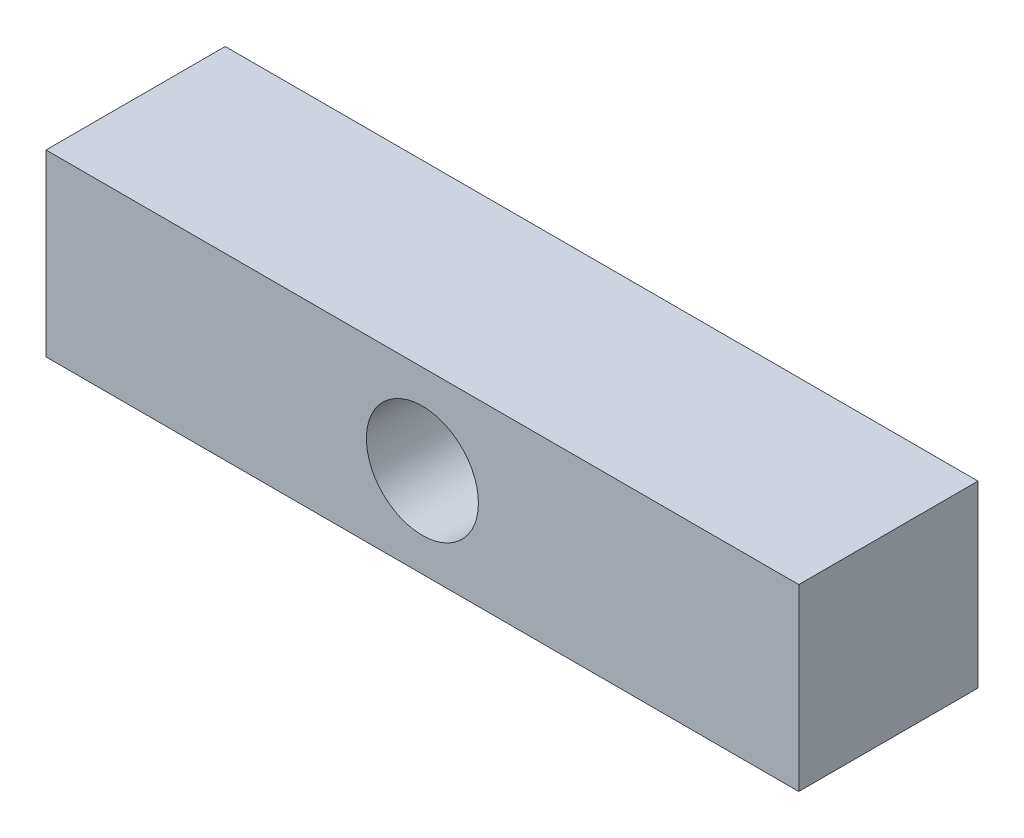
ISO-10303-21;
HEADER;
FILE_DESCRIPTION(('STEP AP214'),'2;1');
FILE_NAME('part.step','',(''),(''),'','','');
FILE_SCHEMA(('AUTOMOTIVE_DESIGN { 1 0 10303 214 1 1 1 1 }'));
ENDSEC;
DATA;
#1=APPLICATION_CONTEXT('core data for automotive mechanical design processes');
#2=APPLICATION_PROTOCOL_DEFINITION('international standard','automotive_design',2000,#1);
#3=PRODUCT_CONTEXT('',#1,'mechanical');
#4=PRODUCT('Part','Part','',(#3));
#5=PRODUCT_RELATED_PRODUCT_CATEGORY('part','',(#4));
#6=PRODUCT_DEFINITION_FORMATION('','',#4);
#7=PRODUCT_DEFINITION_CONTEXT('part definition',#1,'design');
#8=PRODUCT_DEFINITION('design','',#6,#7);
#9=PRODUCT_DEFINITION_SHAPE('','',#8);
#10=(LENGTH_UNIT() NAMED_UNIT(*) SI_UNIT(.MILLI.,.METRE.));
#11=(NAMED_UNIT(*) PLANE_ANGLE_UNIT() SI_UNIT($,.RADIAN.));
#12=(NAMED_UNIT(*) SI_UNIT($,.STERADIAN.) SOLID_ANGLE_UNIT());
#13=UNCERTAINTY_MEASURE_WITH_UNIT(LENGTH_MEASURE(1.E-05),#10,'distance_accuracy_value','');
#14=(GEOMETRIC_REPRESENTATION_CONTEXT(3) GLOBAL_UNCERTAINTY_ASSIGNED_CONTEXT((#13)) GLOBAL_UNIT_ASSIGNED_CONTEXT((#10,
#11,#12)) REPRESENTATION_CONTEXT('',''));
#15=CARTESIAN_POINT('',(0.,0.,0.));
#16=DIRECTION('',(0.,0.,1.));
#17=DIRECTION('',(1.,0.,0.));
#18=AXIS2_PLACEMENT_3D('',#15,#16,#17);
#19=CARTESIAN_POINT('',(53.34,12.7,25.4));
#20=DIRECTION('',(1.,0.,0.));
#21=DIRECTION('',(0.,0.,-1.));
#22=AXIS2_PLACEMENT_3D('',#19,#20,#21);
#23=PLANE('',#22);
#24=DIRECTION('',(0.,-1.,0.));
#25=VECTOR('',#24,1.);
#26=CARTESIAN_POINT('',(53.34,12.7,0.));
#27=LINE('',#26,#25);
#28=CARTESIAN_POINT('',(53.34,12.7,0.));
#29=VERTEX_POINT('',#28);
#30=CARTESIAN_POINT('',(53.34,-12.7,0.));
#31=VERTEX_POINT('',#30);
#32=EDGE_CURVE('E101',#29,#31,#27,.T.);
#33=ORIENTED_EDGE('',*,*,#32,.F.);
#34=DIRECTION('',(0.,0.,-1.));
#35=VECTOR('',#34,1.);
#36=CARTESIAN_POINT('',(53.34,12.7,25.4));
#37=LINE('',#36,#35);
#38=CARTESIAN_POINT('',(53.34,12.7,25.4));
#39=VERTEX_POINT('',#38);
#40=EDGE_CURVE('E11',#39,#29,#37,.T.);
#41=ORIENTED_EDGE('',*,*,#40,.F.);
#42=DIRECTION('',(0.,-1.,0.));
#43=VECTOR('',#42,1.);
#44=CARTESIAN_POINT('',(53.34,12.7,25.4));
#45=LINE('',#44,#43);
#46=CARTESIAN_POINT('',(53.34,-12.7,25.4));
#47=VERTEX_POINT('',#46);
#48=EDGE_CURVE('E95',#39,#47,#45,.T.);
#49=ORIENTED_EDGE('',*,*,#48,.T.);
#50=DIRECTION('',(0.,0.,-1.));
#51=VECTOR('',#50,1.);
#52=CARTESIAN_POINT('',(53.34,-12.7,25.4));
#53=LINE('',#52,#51);
#54=EDGE_CURVE('E38',#47,#31,#53,.T.);
#55=ORIENTED_EDGE('',*,*,#54,.T.);
#56=EDGE_LOOP('',(#33,#41,#49,#55));
#57=FACE_BOUND('',#56,.T.);
#58=ADVANCED_FACE('F35',(#57),#23,.T.);
#59=CARTESIAN_POINT('',(53.34,12.7,25.4));
#60=DIRECTION('',(0.,-1.,0.));
#61=DIRECTION('',(0.,0.,-1.));
#62=AXIS2_PLACEMENT_3D('',#59,#60,#61);
#63=PLANE('',#62);
#64=DIRECTION('',(-1.,0.,0.));
#65=VECTOR('',#64,1.);
#66=CARTESIAN_POINT('',(53.34,12.7,0.));
#67=LINE('',#66,#65);
#68=CARTESIAN_POINT('',(-53.34,12.7,0.));
#69=VERTEX_POINT('',#68);
#70=EDGE_CURVE('E68',#29,#69,#67,.T.);
#71=ORIENTED_EDGE('',*,*,#70,.T.);
#72=DIRECTION('',(0.,0.,-1.));
#73=VECTOR('',#72,1.);
#74=CARTESIAN_POINT('',(-53.34,12.7,25.4));
#75=LINE('',#74,#73);
#76=CARTESIAN_POINT('',(-53.34,12.7,25.4));
#77=VERTEX_POINT('',#76);
#78=EDGE_CURVE('E44',#77,#69,#75,.T.);
#79=ORIENTED_EDGE('',*,*,#78,.F.);
#80=DIRECTION('',(-1.,0.,0.));
#81=VECTOR('',#80,1.);
#82=CARTESIAN_POINT('',(53.34,12.7,25.4));
#83=LINE('',#82,#81);
#84=EDGE_CURVE('E85',#39,#77,#83,.T.);
#85=ORIENTED_EDGE('',*,*,#84,.F.);
#86=ORIENTED_EDGE('',*,*,#40,.T.);
#87=EDGE_LOOP('',(#71,#79,#85,#86));
#88=FACE_BOUND('',#87,.T.);
#89=ADVANCED_FACE('F112',(#88),#63,.F.);
#90=CARTESIAN_POINT('',(-53.34,12.7,25.4));
#91=DIRECTION('',(1.,0.,0.));
#92=DIRECTION('',(0.,0.,-1.));
#93=AXIS2_PLACEMENT_3D('',#90,#91,#92);
#94=PLANE('',#93);
#95=DIRECTION('',(0.,-1.,0.));
#96=VECTOR('',#95,1.);
#97=CARTESIAN_POINT('',(-53.34,12.7,0.));
#98=LINE('',#97,#96);
#99=CARTESIAN_POINT('',(-53.34,-12.7,0.));
#100=VERTEX_POINT('',#99);
#101=EDGE_CURVE('E92',#69,#100,#98,.T.);
#102=ORIENTED_EDGE('',*,*,#101,.T.);
#103=DIRECTION('',(0.,0.,-1.));
#104=VECTOR('',#103,1.);
#105=CARTESIAN_POINT('',(-53.34,-12.7,25.4));
#106=LINE('',#105,#104);
#107=CARTESIAN_POINT('',(-53.34,-12.7,25.4));
#108=VERTEX_POINT('',#107);
#109=EDGE_CURVE('E89',#108,#100,#106,.T.);
#110=ORIENTED_EDGE('',*,*,#109,.F.);
#111=DIRECTION('',(0.,-1.,0.));
#112=VECTOR('',#111,1.);
#113=CARTESIAN_POINT('',(-53.34,12.7,25.4));
#114=LINE('',#113,#112);
#115=EDGE_CURVE('E80',#77,#108,#114,.T.);
#116=ORIENTED_EDGE('',*,*,#115,.F.);
#117=ORIENTED_EDGE('',*,*,#78,.T.);
#118=EDGE_LOOP('',(#102,#110,#116,#117));
#119=FACE_BOUND('',#118,.T.);
#120=ADVANCED_FACE('F90',(#119),#94,.F.);
#121=CARTESIAN_POINT('',(53.34,-12.7,25.4));
#122=DIRECTION('',(0.,-1.,0.));
#123=DIRECTION('',(0.,0.,-1.));
#124=AXIS2_PLACEMENT_3D('',#121,#122,#123);
#125=PLANE('',#124);
#126=DIRECTION('',(-1.,0.,0.));
#127=VECTOR('',#126,1.);
#128=CARTESIAN_POINT('',(53.34,-12.7,0.));
#129=LINE('',#128,#127);
#130=EDGE_CURVE('E104',#31,#100,#129,.T.);
#131=ORIENTED_EDGE('',*,*,#130,.F.);
#132=ORIENTED_EDGE('',*,*,#54,.F.);
#133=DIRECTION('',(-1.,0.,0.));
#134=VECTOR('',#133,1.);
#135=CARTESIAN_POINT('',(53.34,-12.7,25.4));
#136=LINE('',#135,#134);
#137=EDGE_CURVE('E84',#47,#108,#136,.T.);
#138=ORIENTED_EDGE('',*,*,#137,.T.);
#139=ORIENTED_EDGE('',*,*,#109,.T.);
#140=EDGE_LOOP('',(#131,#132,#138,#139));
#141=FACE_BOUND('',#140,.T.);
#142=ADVANCED_FACE('F94',(#141),#125,.T.);
#143=CARTESIAN_POINT('',(0.,0.,25.4));
#144=DIRECTION('',(0.,0.,-1.));
#145=DIRECTION('',(-1.,0.,0.));
#146=AXIS2_PLACEMENT_3D('',#143,#144,#145);
#147=PLANE('',#146);
#148=CARTESIAN_POINT('',(0.,0.,25.4));
#149=DIRECTION('',(0.,0.,1.));
#150=DIRECTION('',(1.,0.,0.));
#151=AXIS2_PLACEMENT_3D('',#148,#149,#150);
#152=CIRCLE('',#151,7.9375);
#153=CARTESIAN_POINT('',(7.9375,0.,25.4));
#154=VERTEX_POINT('',#153);
#155=EDGE_CURVE('E168',#154,#154,#152,.T.);
#156=ORIENTED_EDGE('',*,*,#155,.F.);
#157=EDGE_LOOP('',(#156));
#158=FACE_BOUND('',#157,.T.);
#159=ORIENTED_EDGE('',*,*,#48,.F.);
#160=ORIENTED_EDGE('',*,*,#84,.T.);
#161=ORIENTED_EDGE('',*,*,#115,.T.);
#162=ORIENTED_EDGE('',*,*,#137,.F.);
#163=EDGE_LOOP('',(#159,#160,#161,#162));
#164=FACE_BOUND('',#163,.T.);
#165=ADVANCED_FACE('F83',(#158,#164),#147,.F.);
#166=CARTESIAN_POINT('',(0.,0.,0.));
#167=DIRECTION('',(0.,0.,-1.));
#168=DIRECTION('',(-1.,0.,0.));
#169=AXIS2_PLACEMENT_3D('',#166,#167,#168);
#170=PLANE('',#169);
#171=CARTESIAN_POINT('',(0.,0.,0.));
#172=DIRECTION('',(0.,0.,-1.));
#173=DIRECTION('',(-1.,0.,0.));
#174=AXIS2_PLACEMENT_3D('',#171,#172,#173);
#175=CIRCLE('',#174,4.01319999999999);
#176=CARTESIAN_POINT('',(-4.01319999999999,0.,0.));
#177=VERTEX_POINT('',#176);
#178=EDGE_CURVE('E175',#177,#177,#175,.T.);
#179=ORIENTED_EDGE('',*,*,#178,.F.);
#180=EDGE_LOOP('',(#179));
#181=FACE_BOUND('',#180,.T.);
#182=CARTESIAN_POINT('',(-38.1,0.,0.));
#183=DIRECTION('',(0.,0.,1.));
#184=DIRECTION('',(1.,0.,0.));
#185=AXIS2_PLACEMENT_3D('',#182,#183,#184);
#186=CIRCLE('',#185,8.1915);
#187=CARTESIAN_POINT('',(-46.2915,0.,0.));
#188=VERTEX_POINT('',#187);
#189=EDGE_CURVE('E181',#188,#188,#186,.T.);
#190=ORIENTED_EDGE('',*,*,#189,.T.);
#191=EDGE_LOOP('',(#190));
#192=FACE_BOUND('',#191,.T.);
#193=CARTESIAN_POINT('',(38.1,0.,0.));
#194=DIRECTION('',(0.,0.,1.));
#195=DIRECTION('',(1.,0.,0.));
#196=AXIS2_PLACEMENT_3D('',#193,#194,#195);
#197=CIRCLE('',#196,8.1915);
#198=CARTESIAN_POINT('',(29.9085,0.,0.));
#199=VERTEX_POINT('',#198);
#200=EDGE_CURVE('E184',#199,#199,#197,.T.);
#201=ORIENTED_EDGE('',*,*,#200,.T.);
#202=EDGE_LOOP('',(#201));
#203=FACE_BOUND('',#202,.T.);
#204=ORIENTED_EDGE('',*,*,#32,.T.);
#205=ORIENTED_EDGE('',*,*,#130,.T.);
#206=ORIENTED_EDGE('',*,*,#101,.F.);
#207=ORIENTED_EDGE('',*,*,#70,.F.);
#208=EDGE_LOOP('',(#204,#205,#206,#207));
#209=FACE_BOUND('',#208,.T.);
#210=ADVANCED_FACE('F110',(#181,#192,#203,#209),#170,.T.);
#211=CARTESIAN_POINT('',(38.1,0.,19.05));
#212=DIRECTION('',(0.,0.,-1.));
#213=DIRECTION('',(-1.,0.,0.));
#214=AXIS2_PLACEMENT_3D('',#211,#212,#213);
#215=CYLINDRICAL_SURFACE('',#214,8.1915);
#216=CARTESIAN_POINT('',(38.1,0.,19.05));
#217=DIRECTION('',(0.,0.,1.));
#218=DIRECTION('',(1.,0.,0.));
#219=AXIS2_PLACEMENT_3D('',#216,#217,#218);
#220=CIRCLE('',#219,8.1915);
#221=CARTESIAN_POINT('',(29.9085,0.,19.05));
#222=VERTEX_POINT('',#221);
#223=EDGE_CURVE('E178',#222,#222,#220,.T.);
#224=CARTESIAN_POINT('',(29.9085,0.,19.05));
#225=CARTESIAN_POINT('',(29.9085,0.,18.8515625));
#226=CARTESIAN_POINT('',(29.9085,0.,18.653125));
#227=CARTESIAN_POINT('',(29.9085,0.,18.25625));
#228=CARTESIAN_POINT('',(29.9085,0.,18.0578125));
#229=CARTESIAN_POINT('',(29.9085,0.,17.6609375));
#230=CARTESIAN_POINT('',(29.9085,0.,17.4625));
#231=CARTESIAN_POINT('',(29.9085,0.,17.065625));
#232=CARTESIAN_POINT('',(29.9085,0.,16.8671875));
#233=CARTESIAN_POINT('',(29.9085,0.,16.4703125));
#234=CARTESIAN_POINT('',(29.9085,0.,16.271875));
#235=CARTESIAN_POINT('',(29.9085,0.,15.875));
#236=CARTESIAN_POINT('',(29.9085,0.,15.6765625));
#237=CARTESIAN_POINT('',(29.9085,0.,15.2796875));
#238=CARTESIAN_POINT('',(29.9085,0.,15.08125));
#239=CARTESIAN_POINT('',(29.9085,0.,14.684375));
#240=CARTESIAN_POINT('',(29.9085,0.,14.4859375));
#241=CARTESIAN_POINT('',(29.9085,0.,14.0890625));
#242=CARTESIAN_POINT('',(29.9085,0.,13.890625));
#243=CARTESIAN_POINT('',(29.9085,0.,13.49375));
#244=CARTESIAN_POINT('',(29.9085,0.,13.2953125));
#245=CARTESIAN_POINT('',(29.9085,0.,12.8984375));
#246=CARTESIAN_POINT('',(29.9085,0.,12.7));
#247=CARTESIAN_POINT('',(29.9085,0.,12.303125));
#248=CARTESIAN_POINT('',(29.9085,0.,12.1046875));
#249=CARTESIAN_POINT('',(29.9085,0.,11.7078125));
#250=CARTESIAN_POINT('',(29.9085,0.,11.509375));
#251=CARTESIAN_POINT('',(29.9085,0.,11.1125));
#252=CARTESIAN_POINT('',(29.9085,0.,10.9140625));
#253=CARTESIAN_POINT('',(29.9085,0.,10.5171875));
#254=CARTESIAN_POINT('',(29.9085,0.,10.31875));
#255=CARTESIAN_POINT('',(29.9085,0.,9.921875));
#256=CARTESIAN_POINT('',(29.9085,0.,9.7234375));
#257=CARTESIAN_POINT('',(29.9085,0.,9.3265625));
#258=CARTESIAN_POINT('',(29.9085,0.,9.128125));
#259=CARTESIAN_POINT('',(29.9085,0.,8.73125));
#260=CARTESIAN_POINT('',(29.9085,0.,8.5328125));
#261=CARTESIAN_POINT('',(29.9085,0.,8.1359375));
#262=CARTESIAN_POINT('',(29.9085,0.,7.9375));
#263=CARTESIAN_POINT('',(29.9085,0.,7.540625));
#264=CARTESIAN_POINT('',(29.9085,0.,7.3421875));
#265=CARTESIAN_POINT('',(29.9085,0.,6.9453125));
#266=CARTESIAN_POINT('',(29.9085,0.,6.746875));
#267=CARTESIAN_POINT('',(29.9085,0.,6.35));
#268=CARTESIAN_POINT('',(29.9085,0.,6.1515625));
#269=CARTESIAN_POINT('',(29.9085,0.,5.7546875));
#270=CARTESIAN_POINT('',(29.9085,0.,5.55625));
#271=CARTESIAN_POINT('',(29.9085,0.,5.159375));
#272=CARTESIAN_POINT('',(29.9085,0.,4.9609375));
#273=CARTESIAN_POINT('',(29.9085,0.,4.5640625));
#274=CARTESIAN_POINT('',(29.9085,0.,4.365625));
#275=CARTESIAN_POINT('',(29.9085,0.,3.96875));
#276=CARTESIAN_POINT('',(29.9085,0.,3.7703125));
#277=CARTESIAN_POINT('',(29.9085,0.,3.3734375));
#278=CARTESIAN_POINT('',(29.9085,0.,3.175));
#279=CARTESIAN_POINT('',(29.9085,0.,2.778125));
#280=CARTESIAN_POINT('',(29.9085,0.,2.5796875));
#281=CARTESIAN_POINT('',(29.9085,0.,2.1828125));
#282=CARTESIAN_POINT('',(29.9085,0.,1.984375));
#283=CARTESIAN_POINT('',(29.9085,0.,1.5875));
#284=CARTESIAN_POINT('',(29.9085,0.,1.3890625));
#285=CARTESIAN_POINT('',(29.9085,0.,0.992187500000001));
#286=CARTESIAN_POINT('',(29.9085,0.,0.793750000000001));
#287=CARTESIAN_POINT('',(29.9085,0.,0.396875));
#288=CARTESIAN_POINT('',(29.9085,0.,0.1984375));
#289=CARTESIAN_POINT('',(29.9085,0.,0.));
#290=B_SPLINE_CURVE_WITH_KNOTS('',3,(#224,#225,#226,#227,#228,#229,#230,#231,#232,#233,#234,
#235,#236,#237,#238,#239,#240,#241,#242,#243,#244,#245,#246,#247,#248,#249,#250,#251,#252,#253,
#254,#255,#256,#257,#258,#259,#260,#261,#262,#263,#264,#265,#266,#267,#268,#269,#270,#271,#272,
#273,#274,#275,#276,#277,#278,#279,#280,#281,#282,#283,#284,#285,#286,#287,#288,#289),
.UNSPECIFIED.,.F.,.F.,(4,2,2,2,2,2,2,2,2,2,2,2,2,2,2,2,2,2,2,2,2,2,2,2,2,2,2,2,2,2,2,2,4),(0.,
0.5953125,1.190625,1.7859375,2.38125,2.9765625,3.571875,4.1671875,4.7625,5.3578125,5.953125,
6.5484375,7.14375,7.7390625,8.334375,8.9296875,9.525,10.1203125,10.715625,11.3109375,11.90625,
12.5015625,13.096875,13.6921875,14.2875,14.8828125,15.478125,16.0734375,16.66875,17.2640625,
17.859375,18.4546875,19.05),.UNSPECIFIED.);
#291=EDGE_CURVE('BSEAM131',#222,#199,#290,.T.);
#292=ORIENTED_EDGE('',*,*,#223,.T.);
#293=ORIENTED_EDGE('',*,*,#200,.F.);
#294=ORIENTED_EDGE('',*,*,#291,.T.);
#295=ORIENTED_EDGE('',*,*,#291,.F.);
#296=EDGE_LOOP('',(#292,#294,#293,#295));
#297=FACE_BOUND('',#296,.T.);
#298=ADVANCED_FACE('F131',(#297),#215,.F.);
#299=CARTESIAN_POINT('',(38.1,0.,19.05));
#300=DIRECTION('',(0.,0.,1.));
#301=DIRECTION('',(1.,0.,0.));
#302=AXIS2_PLACEMENT_3D('',#299,#300,#301);
#303=PLANE('',#302);
#304=ORIENTED_EDGE('',*,*,#223,.F.);
#305=EDGE_LOOP('',(#304));
#306=FACE_BOUND('',#305,.T.);
#307=ADVANCED_FACE('F135',(#306),#303,.F.);
#308=CARTESIAN_POINT('',(-38.1,0.,19.05));
#309=DIRECTION('',(0.,0.,-1.));
#310=DIRECTION('',(-1.,0.,0.));
#311=AXIS2_PLACEMENT_3D('',#308,#309,#310);
#312=CYLINDRICAL_SURFACE('',#311,8.1915);
#313=CARTESIAN_POINT('',(-38.1,0.,19.05));
#314=DIRECTION('',(0.,0.,1.));
#315=DIRECTION('',(1.,0.,0.));
#316=AXIS2_PLACEMENT_3D('',#313,#314,#315);
#317=CIRCLE('',#316,8.1915);
#318=CARTESIAN_POINT('',(-46.2915,0.,19.05));
#319=VERTEX_POINT('',#318);
#320=EDGE_CURVE('E105',#319,#319,#317,.T.);
#321=CARTESIAN_POINT('',(-46.2915,0.,19.05));
#322=CARTESIAN_POINT('',(-46.2915,0.,18.8515625));
#323=CARTESIAN_POINT('',(-46.2915,0.,18.653125));
#324=CARTESIAN_POINT('',(-46.2915,0.,18.25625));
#325=CARTESIAN_POINT('',(-46.2915,0.,18.0578125));
#326=CARTESIAN_POINT('',(-46.2915,0.,17.6609375));
#327=CARTESIAN_POINT('',(-46.2915,0.,17.4625));
#328=CARTESIAN_POINT('',(-46.2915,0.,17.065625));
#329=CARTESIAN_POINT('',(-46.2915,0.,16.8671875));
#330=CARTESIAN_POINT('',(-46.2915,0.,16.4703125));
#331=CARTESIAN_POINT('',(-46.2915,0.,16.271875));
#332=CARTESIAN_POINT('',(-46.2915,0.,15.875));
#333=CARTESIAN_POINT('',(-46.2915,0.,15.6765625));
#334=CARTESIAN_POINT('',(-46.2915,0.,15.2796875));
#335=CARTESIAN_POINT('',(-46.2915,0.,15.08125));
#336=CARTESIAN_POINT('',(-46.2915,0.,14.684375));
#337=CARTESIAN_POINT('',(-46.2915,0.,14.4859375));
#338=CARTESIAN_POINT('',(-46.2915,0.,14.0890625));
#339=CARTESIAN_POINT('',(-46.2915,0.,13.890625));
#340=CARTESIAN_POINT('',(-46.2915,0.,13.49375));
#341=CARTESIAN_POINT('',(-46.2915,0.,13.2953125));
#342=CARTESIAN_POINT('',(-46.2915,0.,12.8984375));
#343=CARTESIAN_POINT('',(-46.2915,0.,12.7));
#344=CARTESIAN_POINT('',(-46.2915,0.,12.303125));
#345=CARTESIAN_POINT('',(-46.2915,0.,12.1046875));
#346=CARTESIAN_POINT('',(-46.2915,0.,11.7078125));
#347=CARTESIAN_POINT('',(-46.2915,0.,11.509375));
#348=CARTESIAN_POINT('',(-46.2915,0.,11.1125));
#349=CARTESIAN_POINT('',(-46.2915,0.,10.9140625));
#350=CARTESIAN_POINT('',(-46.2915,0.,10.5171875));
#351=CARTESIAN_POINT('',(-46.2915,0.,10.31875));
#352=CARTESIAN_POINT('',(-46.2915,0.,9.921875));
#353=CARTESIAN_POINT('',(-46.2915,0.,9.7234375));
#354=CARTESIAN_POINT('',(-46.2915,0.,9.3265625));
#355=CARTESIAN_POINT('',(-46.2915,0.,9.128125));
#356=CARTESIAN_POINT('',(-46.2915,0.,8.73125));
#357=CARTESIAN_POINT('',(-46.2915,0.,8.5328125));
#358=CARTESIAN_POINT('',(-46.2915,0.,8.1359375));
#359=CARTESIAN_POINT('',(-46.2915,0.,7.9375));
#360=CARTESIAN_POINT('',(-46.2915,0.,7.540625));
#361=CARTESIAN_POINT('',(-46.2915,0.,7.3421875));
#362=CARTESIAN_POINT('',(-46.2915,0.,6.9453125));
#363=CARTESIAN_POINT('',(-46.2915,0.,6.746875));
#364=CARTESIAN_POINT('',(-46.2915,0.,6.35));
#365=CARTESIAN_POINT('',(-46.2915,0.,6.1515625));
#366=CARTESIAN_POINT('',(-46.2915,0.,5.7546875));
#367=CARTESIAN_POINT('',(-46.2915,0.,5.55625));
#368=CARTESIAN_POINT('',(-46.2915,0.,5.159375));
#369=CARTESIAN_POINT('',(-46.2915,0.,4.9609375));
#370=CARTESIAN_POINT('',(-46.2915,0.,4.5640625));
#371=CARTESIAN_POINT('',(-46.2915,0.,4.365625));
#372=CARTESIAN_POINT('',(-46.2915,0.,3.96875));
#373=CARTESIAN_POINT('',(-46.2915,0.,3.7703125));
#374=CARTESIAN_POINT('',(-46.2915,0.,3.3734375));
#375=CARTESIAN_POINT('',(-46.2915,0.,3.175));
#376=CARTESIAN_POINT('',(-46.2915,0.,2.778125));
#377=CARTESIAN_POINT('',(-46.2915,0.,2.5796875));
#378=CARTESIAN_POINT('',(-46.2915,0.,2.1828125));
#379=CARTESIAN_POINT('',(-46.2915,0.,1.984375));
#380=CARTESIAN_POINT('',(-46.2915,0.,1.5875));
#381=CARTESIAN_POINT('',(-46.2915,0.,1.3890625));
#382=CARTESIAN_POINT('',(-46.2915,0.,0.992187500000001));
#383=CARTESIAN_POINT('',(-46.2915,0.,0.793750000000001));
#384=CARTESIAN_POINT('',(-46.2915,0.,0.396875));
#385=CARTESIAN_POINT('',(-46.2915,0.,0.1984375));
#386=CARTESIAN_POINT('',(-46.2915,0.,0.));
#387=B_SPLINE_CURVE_WITH_KNOTS('',3,(#321,#322,#323,#324,#325,#326,#327,#328,#329,#330,#331,
#332,#333,#334,#335,#336,#337,#338,#339,#340,#341,#342,#343,#344,#345,#346,#347,#348,#349,#350,
#351,#352,#353,#354,#355,#356,#357,#358,#359,#360,#361,#362,#363,#364,#365,#366,#367,#368,#369,
#370,#371,#372,#373,#374,#375,#376,#377,#378,#379,#380,#381,#382,#383,#384,#385,#386),
.UNSPECIFIED.,.F.,.F.,(4,2,2,2,2,2,2,2,2,2,2,2,2,2,2,2,2,2,2,2,2,2,2,2,2,2,2,2,2,2,2,2,4),(0.,
0.5953125,1.190625,1.7859375,2.38125,2.9765625,3.571875,4.1671875,4.7625,5.3578125,5.953125,
6.5484375,7.14375,7.7390625,8.334375,8.9296875,9.525,10.1203125,10.715625,11.3109375,11.90625,
12.5015625,13.096875,13.6921875,14.2875,14.8828125,15.478125,16.0734375,16.66875,17.2640625,
17.859375,18.4546875,19.05),.UNSPECIFIED.);
#388=EDGE_CURVE('BSEAM138',#319,#188,#387,.T.);
#389=ORIENTED_EDGE('',*,*,#320,.T.);
#390=ORIENTED_EDGE('',*,*,#189,.F.);
#391=ORIENTED_EDGE('',*,*,#388,.T.);
#392=ORIENTED_EDGE('',*,*,#388,.F.);
#393=EDGE_LOOP('',(#389,#391,#390,#392));
#394=FACE_BOUND('',#393,.T.);
#395=ADVANCED_FACE('F138',(#394),#312,.F.);
#396=CARTESIAN_POINT('',(0.,0.,19.05));
#397=DIRECTION('',(0.,0.,1.));
#398=DIRECTION('',(1.,0.,0.));
#399=AXIS2_PLACEMENT_3D('',#396,#397,#398);
#400=PLANE('',#399);
#401=ORIENTED_EDGE('',*,*,#320,.F.);
#402=EDGE_LOOP('',(#401));
#403=FACE_BOUND('',#402,.T.);
#404=ADVANCED_FACE('F145',(#403),#400,.F.);
#405=CARTESIAN_POINT('',(0.,0.,25.4));
#406=DIRECTION('',(0.,0.,1.));
#407=DIRECTION('',(1.,0.,0.));
#408=AXIS2_PLACEMENT_3D('',#405,#406,#407);
#409=CYLINDRICAL_SURFACE('',#408,4.01319999999999);
#410=CARTESIAN_POINT('',(0.,0.,6.35));
#411=DIRECTION('',(0.,0.,1.));
#412=DIRECTION('',(1.,0.,0.));
#413=AXIS2_PLACEMENT_3D('',#410,#411,#412);
#414=CIRCLE('',#413,4.0132);
#415=CARTESIAN_POINT('',(4.0132,0.,6.35));
#416=VERTEX_POINT('',#415);
#417=EDGE_CURVE('E170',#416,#416,#414,.T.);
#418=ORIENTED_EDGE('',*,*,#417,.T.);
#419=EDGE_LOOP('',(#418));
#420=FACE_BOUND('',#419,.T.);
#421=ORIENTED_EDGE('',*,*,#178,.T.);
#422=EDGE_LOOP('',(#421));
#423=FACE_BOUND('',#422,.T.);
#424=ADVANCED_FACE('F149',(#420,#423),#409,.F.);
#425=CARTESIAN_POINT('',(4.0132,0.,6.35));
#426=DIRECTION('',(0.,0.,-1.));
#427=DIRECTION('',(-1.,0.,0.));
#428=AXIS2_PLACEMENT_3D('',#425,#426,#427);
#429=PLANE('',#428);
#430=ORIENTED_EDGE('',*,*,#417,.F.);
#431=EDGE_LOOP('',(#430));
#432=FACE_BOUND('',#431,.T.);
#433=CARTESIAN_POINT('',(0.,0.,6.35));
#434=DIRECTION('',(0.,0.,1.));
#435=DIRECTION('',(1.,0.,0.));
#436=AXIS2_PLACEMENT_3D('',#433,#434,#435);
#437=CIRCLE('',#436,7.93749999999999);
#438=CARTESIAN_POINT('',(7.93749999999999,0.,6.35));
#439=VERTEX_POINT('',#438);
#440=EDGE_CURVE('E166',#439,#439,#437,.T.);
#441=ORIENTED_EDGE('',*,*,#440,.T.);
#442=EDGE_LOOP('',(#441));
#443=FACE_BOUND('',#442,.T.);
#444=ADVANCED_FACE('F153',(#432,#443),#429,.F.);
#445=CARTESIAN_POINT('',(0.,0.,25.4));
#446=DIRECTION('',(0.,0.,1.));
#447=DIRECTION('',(1.,0.,0.));
#448=AXIS2_PLACEMENT_3D('',#445,#446,#447);
#449=CYLINDRICAL_SURFACE('',#448,7.9375);
#450=ORIENTED_EDGE('',*,*,#440,.F.);
#451=EDGE_LOOP('',(#450));
#452=FACE_BOUND('',#451,.T.);
#453=ORIENTED_EDGE('',*,*,#155,.T.);
#454=EDGE_LOOP('',(#453));
#455=FACE_BOUND('',#454,.T.);
#456=ADVANCED_FACE('F157',(#452,#455),#449,.F.);
#457=CLOSED_SHELL('',(#58,#89,#120,#142,#165,#210,#298,#307,#395,#404,#424,#444,#456));
#458=MANIFOLD_SOLID_BREP('B2',#457);
#459=ADVANCED_BREP_SHAPE_REPRESENTATION('',(#18,#458),#14);
#460=SHAPE_DEFINITION_REPRESENTATION(#9,#459);
ENDSEC;
END-ISO-10303-21;
